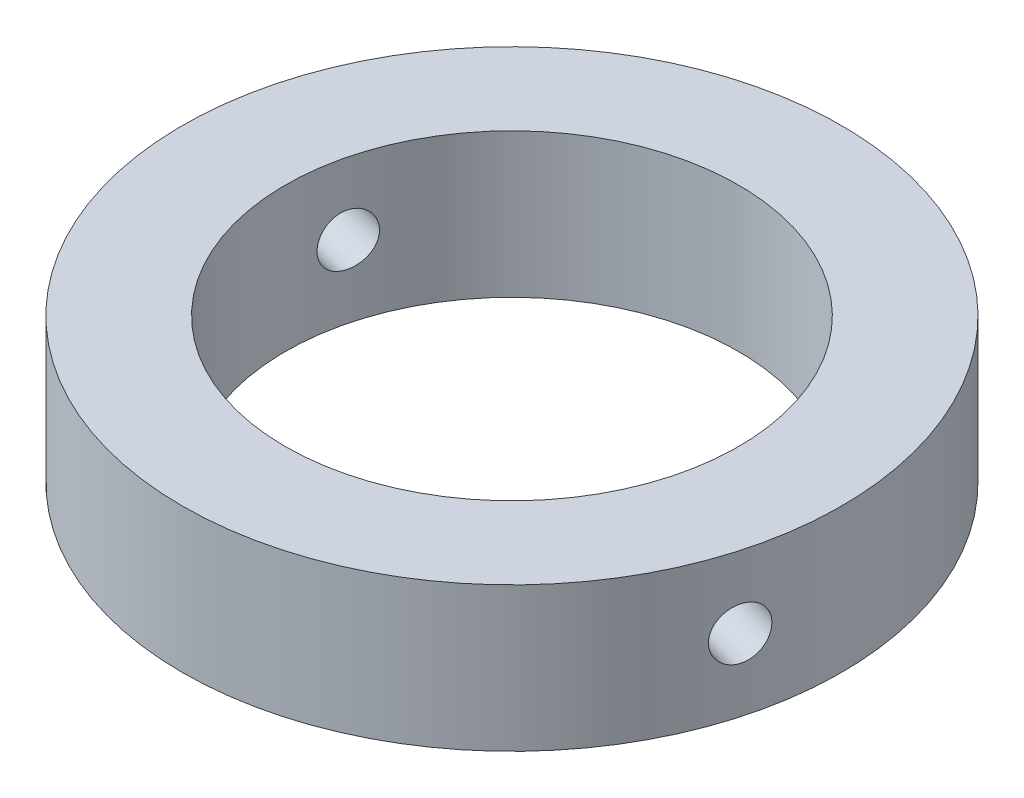
ISO-10303-21;
HEADER;
FILE_DESCRIPTION(('STEP AP214'),'2;1');
FILE_NAME('part.step','',(''),(''),'','','');
FILE_SCHEMA(('AUTOMOTIVE_DESIGN { 1 0 10303 214 1 1 1 1 }'));
ENDSEC;
DATA;
#1=APPLICATION_CONTEXT('core data for automotive mechanical design processes');
#2=APPLICATION_PROTOCOL_DEFINITION('international standard','automotive_design',2000,#1);
#3=PRODUCT_CONTEXT('',#1,'mechanical');
#4=PRODUCT('Part','Part','',(#3));
#5=PRODUCT_RELATED_PRODUCT_CATEGORY('part','',(#4));
#6=PRODUCT_DEFINITION_FORMATION('','',#4);
#7=PRODUCT_DEFINITION_CONTEXT('part definition',#1,'design');
#8=PRODUCT_DEFINITION('design','',#6,#7);
#9=PRODUCT_DEFINITION_SHAPE('','',#8);
#10=(LENGTH_UNIT() NAMED_UNIT(*) SI_UNIT(.MILLI.,.METRE.));
#11=(NAMED_UNIT(*) PLANE_ANGLE_UNIT() SI_UNIT($,.RADIAN.));
#12=(NAMED_UNIT(*) SI_UNIT($,.STERADIAN.) SOLID_ANGLE_UNIT());
#13=UNCERTAINTY_MEASURE_WITH_UNIT(LENGTH_MEASURE(1.E-05),#10,'distance_accuracy_value','');
#14=(GEOMETRIC_REPRESENTATION_CONTEXT(3) GLOBAL_UNCERTAINTY_ASSIGNED_CONTEXT((#13)) GLOBAL_UNIT_ASSIGNED_CONTEXT((#10,
#11,#12)) REPRESENTATION_CONTEXT('',''));
#15=CARTESIAN_POINT('',(0.,0.,0.));
#16=DIRECTION('',(0.,0.,1.));
#17=DIRECTION('',(1.,0.,0.));
#18=AXIS2_PLACEMENT_3D('',#15,#16,#17);
#19=CARTESIAN_POINT('',(0.,7.,0.));
#20=DIRECTION('',(0.,1.,0.));
#21=DIRECTION('',(0.,0.,1.));
#22=AXIS2_PLACEMENT_3D('',#19,#20,#21);
#23=PLANE('',#22);
#24=CARTESIAN_POINT('',(0.,7.,0.));
#25=DIRECTION('',(0.,1.,0.));
#26=DIRECTION('',(0.,0.,1.));
#27=AXIS2_PLACEMENT_3D('',#24,#25,#26);
#28=CIRCLE('',#27,16.);
#29=CARTESIAN_POINT('',(0.,7.,16.));
#30=VERTEX_POINT('',#29);
#31=EDGE_CURVE('E64',#30,#30,#28,.T.);
#32=ORIENTED_EDGE('',*,*,#31,.T.);
#33=EDGE_LOOP('',(#32));
#34=FACE_BOUND('',#33,.T.);
#35=CARTESIAN_POINT('',(0.,7.,0.));
#36=DIRECTION('',(0.,1.,0.));
#37=DIRECTION('',(0.,0.,1.));
#38=AXIS2_PLACEMENT_3D('',#35,#36,#37);
#39=CIRCLE('',#38,11.);
#40=CARTESIAN_POINT('',(0.,7.,11.));
#41=VERTEX_POINT('',#40);
#42=EDGE_CURVE('E128',#41,#41,#39,.T.);
#43=ORIENTED_EDGE('',*,*,#42,.F.);
#44=EDGE_LOOP('',(#43));
#45=FACE_BOUND('',#44,.T.);
#46=ADVANCED_FACE('F51',(#34,#45),#23,.T.);
#47=CARTESIAN_POINT('',(0.,0.,0.));
#48=DIRECTION('',(0.,1.,0.));
#49=DIRECTION('',(0.,0.,1.));
#50=AXIS2_PLACEMENT_3D('',#47,#48,#49);
#51=PLANE('',#50);
#52=CARTESIAN_POINT('',(0.,0.,0.));
#53=DIRECTION('',(0.,1.,0.));
#54=DIRECTION('',(0.,0.,1.));
#55=AXIS2_PLACEMENT_3D('',#52,#53,#54);
#56=CIRCLE('',#55,16.);
#57=CARTESIAN_POINT('',(0.,0.,16.));
#58=VERTEX_POINT('',#57);
#59=EDGE_CURVE('E137',#58,#58,#56,.T.);
#60=ORIENTED_EDGE('',*,*,#59,.F.);
#61=EDGE_LOOP('',(#60));
#62=FACE_BOUND('',#61,.T.);
#63=CARTESIAN_POINT('',(0.,0.,0.));
#64=DIRECTION('',(0.,1.,0.));
#65=DIRECTION('',(0.,0.,1.));
#66=AXIS2_PLACEMENT_3D('',#63,#64,#65);
#67=CIRCLE('',#66,11.);
#68=CARTESIAN_POINT('',(0.,0.,11.));
#69=VERTEX_POINT('',#68);
#70=EDGE_CURVE('E131',#69,#69,#67,.T.);
#71=ORIENTED_EDGE('',*,*,#70,.T.);
#72=EDGE_LOOP('',(#71));
#73=FACE_BOUND('',#72,.T.);
#74=ADVANCED_FACE('F107',(#62,#73),#51,.F.);
#75=CARTESIAN_POINT('',(0.,7.,0.));
#76=DIRECTION('',(0.,-1.,0.));
#77=DIRECTION('',(0.,0.,-1.));
#78=AXIS2_PLACEMENT_3D('',#75,#76,#77);
#79=CYLINDRICAL_SURFACE('',#78,16.);
#80=CARTESIAN_POINT('',(15.7005646405908,3.49811291641236,3.08095276929565));
#81=CARTESIAN_POINT('',(15.7005644420691,3.42801491445671,3.08095589968122));
#82=CARTESIAN_POINT('',(15.6994251998469,3.35786881383582,3.08677707140095));
#83=CARTESIAN_POINT('',(15.6948601261584,3.21951637072107,3.1099034032266));
#84=CARTESIAN_POINT('',(15.6914316842296,3.15131233552285,3.12722167378658));
#85=CARTESIAN_POINT('',(15.6822773810597,3.01886792383957,3.17280844439401));
#86=CARTESIAN_POINT('',(15.6765527973742,2.9546253661132,3.20107085490383));
#87=CARTESIAN_POINT('',(15.662802395416,2.8318954795411,3.26768606611278));
#88=CARTESIAN_POINT('',(15.654777078742,2.77340689996019,3.306036667266));
#89=CARTESIAN_POINT('',(15.6364246705791,2.66369661723308,3.3917758911864));
#90=CARTESIAN_POINT('',(15.6260929779383,2.61248977997289,3.43918255286731));
#91=CARTESIAN_POINT('',(15.6032019991841,2.51892416134812,3.54158640447706));
#92=CARTESIAN_POINT('',(15.5906426170271,2.47656576164207,3.59658392165148));
#93=CARTESIAN_POINT('',(15.5634156314361,2.4018507551443,3.71263318028883));
#94=CARTESIAN_POINT('',(15.548745376405,2.36950689174767,3.77369250599604));
#95=CARTESIAN_POINT('',(15.5175394202269,2.31582060465392,3.9000255586503));
#96=CARTESIAN_POINT('',(15.5010037482194,2.29447800913705,3.96529921975921));
#97=CARTESIAN_POINT('',(15.4664425950264,2.26344256102981,4.09802931182976));
#98=CARTESIAN_POINT('',(15.448420251224,2.25372581385766,4.16548097211445));
#99=CARTESIAN_POINT('',(15.4113083093587,2.24614403909359,4.30075509636418));
#100=CARTESIAN_POINT('',(15.3922187289877,2.24827881509283,4.36857755416558));
#101=CARTESIAN_POINT('',(15.3535727734916,2.26431990296018,4.5025162285706));
#102=CARTESIAN_POINT('',(15.3340175078403,2.2782005183206,4.56863584538343));
#103=CARTESIAN_POINT('',(15.2950405576221,2.31729933096242,4.69747455883542));
#104=CARTESIAN_POINT('',(15.2756188741963,2.34251762497856,4.76019362645548));
#105=CARTESIAN_POINT('',(15.2375857832645,2.4036047068125,4.88057094626758));
#106=CARTESIAN_POINT('',(15.2189752793892,2.43948504083461,4.93822362377868));
#107=CARTESIAN_POINT('',(15.1833067205505,2.52086930547655,5.0468276629502));
#108=CARTESIAN_POINT('',(15.1662486932097,2.56637340728071,5.0977789053816));
#109=CARTESIAN_POINT('',(15.1343427421401,2.66585842397162,5.19173802772221));
#110=CARTESIAN_POINT('',(15.1195008446142,2.71986166051195,5.23472432269902));
#111=CARTESIAN_POINT('',(15.0927253242134,2.83473408968917,5.31143089749065));
#112=CARTESIAN_POINT('',(15.0807917033363,2.89560328704228,5.34515117094061));
#113=CARTESIAN_POINT('',(15.0603703851021,3.0224951089598,5.40242287902375));
#114=CARTESIAN_POINT('',(15.0518830420686,3.08851826258843,5.42597326807231));
#115=CARTESIAN_POINT('',(15.0387517332543,3.22383660707186,5.46226344985772));
#116=CARTESIAN_POINT('',(15.0341076965721,3.29313173754015,5.4750034420254));
#117=CARTESIAN_POINT('',(15.0288905307231,3.43283107296942,5.48930855553032));
#118=CARTESIAN_POINT('',(15.0283066819864,3.50323186528608,5.49090310274886));
#119=CARTESIAN_POINT('',(15.0312093048932,3.6433162626235,5.48295212880204));
#120=CARTESIAN_POINT('',(15.0346957432326,3.71299987350771,5.47340669878667));
#121=CARTESIAN_POINT('',(15.0455663874324,3.849582580776,5.44345320495769));
#122=CARTESIAN_POINT('',(15.0529456768054,3.91648507486175,5.42305884256225));
#123=CARTESIAN_POINT('',(15.0712554443455,4.04571157898017,5.371963474165));
#124=CARTESIAN_POINT('',(15.082185972691,4.10803552430325,5.34126232252935));
#125=CARTESIAN_POINT('',(15.1071296450464,4.22647881737394,5.27029847296326));
#126=CARTESIAN_POINT('',(15.1211491842719,4.2825849246483,5.2300159245918));
#127=CARTESIAN_POINT('',(15.151644253957,4.386866198045,5.14100029610007));
#128=CARTESIAN_POINT('',(15.1681198216129,4.43504124402854,5.09226708799315));
#129=CARTESIAN_POINT('',(15.2028767864163,4.52219915444093,4.98754268323245));
#130=CARTESIAN_POINT('',(15.2211620413271,4.56116175447206,4.93153589838993));
#131=CARTESIAN_POINT('',(15.2587827739058,4.62864983266333,4.8138714333799));
#132=CARTESIAN_POINT('',(15.2781182421748,4.65717540421142,4.75221380378093));
#133=CARTESIAN_POINT('',(15.3171014208714,4.70294476248306,4.6250210649721));
#134=CARTESIAN_POINT('',(15.3367487569412,4.72020116139698,4.55949038031221));
#135=CARTESIAN_POINT('',(15.3757100318623,4.74298356449726,4.42632483848362));
#136=CARTESIAN_POINT('',(15.3950239761792,4.74850976116927,4.35869001586105));
#137=CARTESIAN_POINT('',(15.4326812097393,4.7476727631858,4.22341887433808));
#138=CARTESIAN_POINT('',(15.4510269464529,4.74134118507953,4.15578303888512));
#139=CARTESIAN_POINT('',(15.486322206994,4.71703419600539,4.02226240962753));
#140=CARTESIAN_POINT('',(15.5032717287464,4.69905876773254,3.95637761842543));
#141=CARTESIAN_POINT('',(15.5354050268089,4.65198214768293,3.82825758586287));
#142=CARTESIAN_POINT('',(15.550588876009,4.6228814153908,3.7660221939015));
#143=CARTESIAN_POINT('',(15.5789331057839,4.55438401045252,3.64699751383771));
#144=CARTESIAN_POINT('',(15.5920935239773,4.51498752925744,3.59020812449286));
#145=CARTESIAN_POINT('',(15.6162613107074,4.42689848383207,3.48358778434783));
#146=CARTESIAN_POINT('',(15.62726313788,4.37818261207289,3.43377483425048));
#147=CARTESIAN_POINT('',(15.646990447598,4.27287786715512,3.3427333133688));
#148=CARTESIAN_POINT('',(15.655715376676,4.21628708488255,3.30150683027019));
#149=CARTESIAN_POINT('',(15.670868039766,4.09674177940669,3.2288202267953));
#150=CARTESIAN_POINT('',(15.6772918541651,4.03377663012673,3.19737678225528));
#151=CARTESIAN_POINT('',(15.6878169656134,3.90339096749187,3.14533153112997));
#152=CARTESIAN_POINT('',(15.6919209471144,3.83597570504252,3.12471719533545));
#153=CARTESIAN_POINT('',(15.6967718649969,3.72315092980942,3.10023259771874));
#154=CARTESIAN_POINT('',(15.6981940664078,3.67846812269262,3.09301269821328));
#155=CARTESIAN_POINT('',(15.700090517168,3.58856785894513,3.0833717794504));
#156=CARTESIAN_POINT('',(15.700564768706,3.54335040354914,3.08095074911286));
#157=CARTESIAN_POINT('',(15.7005646405908,3.49811291641236,3.08095276929565));
#158=B_SPLINE_CURVE_WITH_KNOTS('',3,(#80,#81,#82,#83,#84,#85,#86,#87,#88,#89,#90,#91,#92,#93,
#94,#95,#96,#97,#98,#99,#100,#101,#102,#103,#104,#105,#106,#107,#108,#109,#110,#111,#112,#113,
#114,#115,#116,#117,#118,#119,#120,#121,#122,#123,#124,#125,#126,#127,#128,#129,#130,#131,#132,
#133,#134,#135,#136,#137,#138,#139,#140,#141,#142,#143,#144,#145,#146,#147,#148,#149,#150,#151,
#152,#153,#154,#155,#156,#157),.UNSPECIFIED.,.T.,.F.,(4,2,2,2,2,2,2,2,2,2,2,2,2,2,2,2,2,2,2,2,2,
2,2,2,2,2,2,2,2,2,2,2,2,2,2,2,2,2,4),(0.,0.210128842577296,0.42049771331393,0.630749698424032,
0.840955879866511,1.05158522479289,1.26222365289342,1.47312902501727,1.68403110308382,
1.89449896582812,2.1049633406133,2.31496846690295,2.52497538502095,2.73521055914812,
2.94544947318182,3.15625005595317,3.36705078352388,3.57787317875043,3.78869168462875,
3.99895338263198,4.2092133602352,4.41920842291182,4.62920645292116,4.8396433991816,
5.05008353282309,5.26098234750334,5.47187927506665,5.68253976544148,5.89319679897613,
6.10329295426036,6.31338942178842,6.52347721308879,6.73356109805146,6.94417743316642,
7.15484491722764,7.36586955512332,7.57664949811826,7.71225568510991,7.84786155900015),.UNSPECIFIED.);
#159=CARTESIAN_POINT('',(15.7005646405908,3.49811291641236,3.08095276929565));
#160=VERTEX_POINT('',#159);
#161=EDGE_CURVE('E11',#160,#160,#158,.T.);
#162=ORIENTED_EDGE('',*,*,#161,.T.);
#163=EDGE_LOOP('',(#162));
#164=FACE_BOUND('',#163,.T.);
#165=CARTESIAN_POINT('',(-15.7766439830382,3.52658800287419,-2.66411423037106));
#166=CARTESIAN_POINT('',(-15.7766438674801,3.45649000091854,-2.66411736491585));
#167=CARTESIAN_POINT('',(-15.7756591720488,3.38634390029765,-2.66996666298816));
#168=CARTESIAN_POINT('',(-15.7717080950513,3.2479914571829,-2.69320577037316));
#169=CARTESIAN_POINT('',(-15.7687394511089,3.17978742198468,-2.71060875466871));
#170=CARTESIAN_POINT('',(-15.7607955166388,3.0473430103014,-2.75642194955923));
#171=CARTESIAN_POINT('',(-15.755821341965,2.98310045257502,-2.78482603892171));
#172=CARTESIAN_POINT('',(-15.7438397631564,2.86037056600292,-2.85178200719697));
#173=CARTESIAN_POINT('',(-15.7368328021995,2.80188198642202,-2.8903316740526));
#174=CARTESIAN_POINT('',(-15.7207572435844,2.6921717036949,-2.97652681207712));
#175=CARTESIAN_POINT('',(-15.7116845240667,2.64096486643472,-3.02419043767467));
#176=CARTESIAN_POINT('',(-15.6915132733716,2.54739924780994,-3.12716454305188));
#177=CARTESIAN_POINT('',(-15.6804146548501,2.5050408481039,-3.18247535250563));
#178=CARTESIAN_POINT('',(-15.6562702544503,2.43032584160612,-3.29920489933927));
#179=CARTESIAN_POINT('',(-15.6432220227391,2.3979819782095,-3.36063128851939));
#180=CARTESIAN_POINT('',(-15.6153723666303,2.34429569111575,-3.48774638812817));
#181=CARTESIAN_POINT('',(-15.6005709696184,2.32295309559888,-3.55343503197016));
#182=CARTESIAN_POINT('',(-15.5695366895922,2.29191764749164,-3.68703377490711));
#183=CARTESIAN_POINT('',(-15.553306816531,2.28220090031948,-3.75493902191874));
#184=CARTESIAN_POINT('',(-15.519790009452,2.27461912555542,-3.89114845097481));
#185=CARTESIAN_POINT('',(-15.5025030929569,2.27675390155466,-3.9594526263893));
#186=CARTESIAN_POINT('',(-15.4674174468542,2.29279498942201,-4.09436769528503));
#187=CARTESIAN_POINT('',(-15.4496199163706,2.30667560478243,-4.16098195840375));
#188=CARTESIAN_POINT('',(-15.4140683423127,2.34577441742425,-4.29080761963561));
#189=CARTESIAN_POINT('',(-15.3963142991108,2.37099271144039,-4.35401898870959));
#190=CARTESIAN_POINT('',(-15.3614821917773,2.43207979327433,-4.47536122962212));
#191=CARTESIAN_POINT('',(-15.3444048833393,2.46796012729644,-4.53348650480603));
#192=CARTESIAN_POINT('',(-15.3116247170659,2.54934439193838,-4.64299697970722));
#193=CARTESIAN_POINT('',(-15.2959218836861,2.59484849374254,-4.69438205950585));
#194=CARTESIAN_POINT('',(-15.2665152016454,2.69433351043345,-4.78915311751423));
#195=CARTESIAN_POINT('',(-15.2528168054951,2.74833674697378,-4.83251735878414));
#196=CARTESIAN_POINT('',(-15.2280818996779,2.863209176151,-4.90990606301935));
#197=CARTESIAN_POINT('',(-15.2170453918393,2.92407837350411,-4.94393051956913));
#198=CARTESIAN_POINT('',(-15.1981478157935,3.05097019542163,-5.00172291011302));
#199=CARTESIAN_POINT('',(-15.1902870740981,3.11699334905026,-5.02548978950651));
#200=CARTESIAN_POINT('',(-15.1781213506643,3.25231169353369,-5.06211496853032));
#201=CARTESIAN_POINT('',(-15.1738163033303,3.32160682400198,-5.07497346939903));
#202=CARTESIAN_POINT('',(-15.1689797729382,3.46130615943125,-5.08941171948866));
#203=CARTESIAN_POINT('',(-15.1684383532799,3.53170695174791,-5.09102116813125));
#204=CARTESIAN_POINT('',(-15.1711294128945,3.67179134908533,-5.08299611955864));
#205=CARTESIAN_POINT('',(-15.1743618612888,3.74147495996953,-5.07336171434338));
#206=CARTESIAN_POINT('',(-15.1844355112528,3.87805766723783,-5.04313086463185));
#207=CARTESIAN_POINT('',(-15.1912721608794,3.94496016132358,-5.02254824693993));
#208=CARTESIAN_POINT('',(-15.2082224789905,4.07418666544199,-4.97098594506198));
#209=CARTESIAN_POINT('',(-15.2183361937796,4.13651061076508,-4.94000611396445));
#210=CARTESIAN_POINT('',(-15.2413919639185,4.25495390383576,-4.86840662933561));
#211=CARTESIAN_POINT('',(-15.2543398865926,4.31106001111013,-4.82776696297599));
#212=CARTESIAN_POINT('',(-15.2824670879829,4.41534128450682,-4.73797502607281));
#213=CARTESIAN_POINT('',(-15.2976464004933,4.46351633049036,-4.6888226266025));
#214=CARTESIAN_POINT('',(-15.3296180268956,4.55067424090275,-4.58321456507302));
#215=CARTESIAN_POINT('',(-15.3464137844157,4.58963684093389,-4.52674321813605));
#216=CARTESIAN_POINT('',(-15.3809055156354,4.65712491912515,-4.40812380015012));
#217=CARTESIAN_POINT('',(-15.3986014812786,4.68565049067325,-4.34597577990086));
#218=CARTESIAN_POINT('',(-15.4342028677933,4.73141984894488,-4.21779535118723));
#219=CARTESIAN_POINT('',(-15.4521080316025,4.7486762478588,-4.15176737563443));
#220=CARTESIAN_POINT('',(-15.4875293594623,4.77145865095908,-4.01761681839881));
#221=CARTESIAN_POINT('',(-15.5050455298914,4.77698484763109,-3.94949427110527));
#222=CARTESIAN_POINT('',(-15.5391075164323,4.77614784964762,-3.8132733841561));
#223=CARTESIAN_POINT('',(-15.5556557919581,4.76981627154135,-3.74517546296826));
#224=CARTESIAN_POINT('',(-15.587402988117,4.74550928246721,-3.61076702056208));
#225=CARTESIAN_POINT('',(-15.6026019067446,4.72753385419436,-3.54445650200032));
#226=CARTESIAN_POINT('',(-15.6313312595014,4.68045723414475,-3.41553049268341));
#227=CARTESIAN_POINT('',(-15.6448617625069,4.65135650185263,-3.35291484945));
#228=CARTESIAN_POINT('',(-15.6700442247853,4.58285909691434,-3.23318133943957));
#229=CARTESIAN_POINT('',(-15.6816962189827,4.54346261571926,-3.17606337045947));
#230=CARTESIAN_POINT('',(-15.7030321753687,4.45537357029389,-3.06884044467787));
#231=CARTESIAN_POINT('',(-15.7127110748032,4.40665769853471,-3.01875362900477));
#232=CARTESIAN_POINT('',(-15.7300206455855,4.30135295361694,-2.92722164534607));
#233=CARTESIAN_POINT('',(-15.7376508189427,4.24476217134437,-2.8857785789702));
#234=CARTESIAN_POINT('',(-15.750873393905,4.12521686586851,-2.81271621495971));
#235=CARTESIAN_POINT('',(-15.7564623188555,4.06225171658855,-2.78111369110682));
#236=CARTESIAN_POINT('',(-15.7656055573812,3.93186605395369,-2.7288079808549));
#237=CARTESIAN_POINT('',(-15.7691622226877,3.86445079150434,-2.70809219855474));
#238=CARTESIAN_POINT('',(-15.7733630761421,3.75162601627125,-2.68348773239492));
#239=CARTESIAN_POINT('',(-15.7745935925846,3.70694320915445,-2.67623270413813));
#240=CARTESIAN_POINT('',(-15.7762340823728,3.61704294540696,-2.66654494725983));
#241=CARTESIAN_POINT('',(-15.7766440576131,3.57182549001096,-2.66411220750414));
#242=CARTESIAN_POINT('',(-15.7766439830382,3.52658800287419,-2.66411423037106));
#243=B_SPLINE_CURVE_WITH_KNOTS('',3,(#165,#166,#167,#168,#169,#170,#171,#172,#173,#174,#175,
#176,#177,#178,#179,#180,#181,#182,#183,#184,#185,#186,#187,#188,#189,#190,#191,#192,#193,#194,
#195,#196,#197,#198,#199,#200,#201,#202,#203,#204,#205,#206,#207,#208,#209,#210,#211,#212,#213,
#214,#215,#216,#217,#218,#219,#220,#221,#222,#223,#224,#225,#226,#227,#228,#229,#230,#231,#232,
#233,#234,#235,#236,#237,#238,#239,#240,#241,#242),.UNSPECIFIED.,.T.,.F.,(4,2,2,2,2,2,2,2,2,2,2,
2,2,2,2,2,2,2,2,2,2,2,2,2,2,2,2,2,2,2,2,2,2,2,2,2,2,2,4),(0.,0.210128842577296,0.42049771331393,
0.630749698424031,0.84095587986651,1.05158522479289,1.26222365289342,1.47312902501727,
1.68403110308381,1.89449896582811,2.10496334061329,2.31496846690294,2.52497538502094,
2.73521055914811,2.94544947318181,3.15625005595317,3.36705078352387,3.57787317875042,
3.78869168462874,3.99895338263197,4.20921336023519,4.41920842291181,4.62920645292115,
4.83964339918159,5.05008353282308,5.26098234750332,5.47187927506663,5.68253976544147,
5.89319679897611,6.10329295426035,6.31338942178841,6.52347721308877,6.73356109805144,
6.9441774331664,7.15484491722763,7.36586955512331,7.57664949811824,7.71225568510989,
7.84786155900013),.UNSPECIFIED.);
#244=CARTESIAN_POINT('',(-15.7766439830382,3.52658800287419,-2.66411423037106));
#245=VERTEX_POINT('',#244);
#246=EDGE_CURVE('E81',#245,#245,#243,.T.);
#247=ORIENTED_EDGE('',*,*,#246,.T.);
#248=EDGE_LOOP('',(#247));
#249=FACE_BOUND('',#248,.T.);
#250=ORIENTED_EDGE('',*,*,#31,.F.);
#251=EDGE_LOOP('',(#250));
#252=FACE_BOUND('',#251,.T.);
#253=ORIENTED_EDGE('',*,*,#59,.T.);
#254=EDGE_LOOP('',(#253));
#255=FACE_BOUND('',#254,.T.);
#256=ADVANCED_FACE('F53',(#164,#249,#252,#255),#79,.T.);
#257=CARTESIAN_POINT('',(0.,7.,0.));
#258=DIRECTION('',(0.,-1.,0.));
#259=DIRECTION('',(0.,0.,-1.));
#260=AXIS2_PLACEMENT_3D('',#257,#258,#259);
#261=CYLINDRICAL_SURFACE('',#260,11.);
#262=CARTESIAN_POINT('',(-10.9048728688358,3.52658800287419,-1.44351921169341));
#263=CARTESIAN_POINT('',(-10.9048730344096,3.45661858713546,-1.4435223492742));
#264=CARTESIAN_POINT('',(-10.9040991080242,3.3866042178351,-1.44940221485725));
#265=CARTESIAN_POINT('',(-10.9009692426436,3.24852044970176,-1.47275354064532));
#266=CARTESIAN_POINT('',(-10.8986116069599,3.18045321853782,-1.49023743244832));
#267=CARTESIAN_POINT('',(-10.8922224972203,3.04828315523348,-1.53623725738499));
#268=CARTESIAN_POINT('',(-10.8881921005984,2.98417780170832,-1.56474608849399));
#269=CARTESIAN_POINT('',(-10.8783277795428,2.86169538550037,-1.6319103381608));
#270=CARTESIAN_POINT('',(-10.872494187359,2.80331727014766,-1.67056388729503));
#271=CARTESIAN_POINT('',(-10.858855363442,2.69366208223747,-1.75703683149344));
#272=CARTESIAN_POINT('',(-10.8510420555933,2.64241546186687,-1.80489357280344));
#273=CARTESIAN_POINT('',(-10.8333433619051,2.54874063812322,-1.90824917543159));
#274=CARTESIAN_POINT('',(-10.8234578770815,2.5063128562033,-1.96374840177421));
#275=CARTESIAN_POINT('',(-10.8015427968743,2.43137252943777,-2.08092041630146));
#276=CARTESIAN_POINT('',(-10.7895074388629,2.39888728630102,-2.14260959659739));
#277=CARTESIAN_POINT('',(-10.7633788573486,2.34492893459038,-2.27022308818498));
#278=CARTESIAN_POINT('',(-10.7492856975726,2.32345548509168,-2.33614726829007));
#279=CARTESIAN_POINT('',(-10.7193161938218,2.29222054878172,-2.4700084655657));
#280=CARTESIAN_POINT('',(-10.7034478476246,2.28240867701355,-2.53793551438381));
#281=CARTESIAN_POINT('',(-10.6702418703352,2.27461938866694,-2.67410706415277));
#282=CARTESIAN_POINT('',(-10.6529042875822,2.27664158288543,-2.74235155458973));
#283=CARTESIAN_POINT('',(-10.6173583989137,2.29242239545181,-2.87689442091315));
#284=CARTESIAN_POINT('',(-10.5991544785543,2.30612683098066,-2.94320032196127));
#285=CARTESIAN_POINT('',(-10.5624411325248,2.34479854772885,-3.07235212098508));
#286=CARTESIAN_POINT('',(-10.5439317019198,2.36976601104451,-3.13519796300143));
#287=CARTESIAN_POINT('',(-10.5072999133736,2.43031352807852,-3.25586200538619));
#288=CARTESIAN_POINT('',(-10.4891785178231,2.46591728401077,-3.31366860054612));
#289=CARTESIAN_POINT('',(-10.4541540445467,2.54670950142704,-3.42256337173422));
#290=CARTESIAN_POINT('',(-10.4372510130422,2.59189832628527,-3.47365129293548));
#291=CARTESIAN_POINT('',(-10.4053631461035,2.69088201726706,-3.56804134130156));
#292=CARTESIAN_POINT('',(-10.3903896877175,2.74472406365249,-3.61129784925092));
#293=CARTESIAN_POINT('',(-10.3632244204087,2.85932302442144,-3.68853101554693));
#294=CARTESIAN_POINT('',(-10.3510326177049,2.92007995426393,-3.72250765314686));
#295=CARTESIAN_POINT('',(-10.3300700203046,3.04682312925436,-3.78029140315372));
#296=CARTESIAN_POINT('',(-10.3213002971996,3.11281100465283,-3.80409533029521));
#297=CARTESIAN_POINT('',(-10.307669566051,3.24812304032396,-3.84087702997467));
#298=CARTESIAN_POINT('',(-10.3028084032592,3.31744706839599,-3.85385523112716));
#299=CARTESIAN_POINT('',(-10.2972841545012,3.45704951155335,-3.86859169980293));
#300=CARTESIAN_POINT('',(-10.2965978004164,3.52732044507322,-3.87041215498432));
#301=CARTESIAN_POINT('',(-10.2993997114014,3.6671851170773,-3.86294975966265));
#302=CARTESIAN_POINT('',(-10.3028879032615,3.73677886741579,-3.85366710387657));
#303=CARTESIAN_POINT('',(-10.3138276443691,3.87311855107512,-3.82429096101489));
#304=CARTESIAN_POINT('',(-10.3212682597361,3.93987179470749,-3.80422729647619));
#305=CARTESIAN_POINT('',(-10.3396996920027,4.06886357487045,-3.75384145838521));
#306=CARTESIAN_POINT('',(-10.3506906129369,4.13110197903745,-3.72351898421823));
#307=CARTESIAN_POINT('',(-10.3756987063111,4.24959694070775,-3.6532544139334));
#308=CARTESIAN_POINT('',(-10.389728925667,4.30582609750421,-3.61327075668748));
#309=CARTESIAN_POINT('',(-10.4200761436053,4.41042767506543,-3.5247971178709));
#310=CARTESIAN_POINT('',(-10.4363932154657,4.4587998439596,-3.47630686370881));
#311=CARTESIAN_POINT('',(-10.4706122414936,4.54654406354642,-3.37184053789794));
#312=CARTESIAN_POINT('',(-10.488521259201,4.58587290996911,-3.31583047663723));
#313=CARTESIAN_POINT('',(-10.5250469390189,4.65411593352292,-3.19799724449341));
#314=CARTESIAN_POINT('',(-10.5436635890182,4.6830302888106,-3.13617417307397));
#315=CARTESIAN_POINT('',(-10.5807862123377,4.72955131311807,-3.00854881739467));
#316=CARTESIAN_POINT('',(-10.5992923409405,4.74718349145613,-2.94275588065248));
#317=CARTESIAN_POINT('',(-10.6355472806221,4.77072276968577,-2.80890355354194));
#318=CARTESIAN_POINT('',(-10.6532961196124,4.77663030208206,-2.74084424687076));
#319=CARTESIAN_POINT('',(-10.6873744450441,4.77654548393631,-2.60478761483547));
#320=CARTESIAN_POINT('',(-10.7037113623464,4.77061996664064,-2.53679209922377));
#321=CARTESIAN_POINT('',(-10.7346677533338,4.74717812685107,-2.40242857741892));
#322=CARTESIAN_POINT('',(-10.7492872268727,4.72966180337126,-2.33606057136421));
#323=CARTESIAN_POINT('',(-10.7765504676661,4.68355540430322,-2.20688027645653));
#324=CARTESIAN_POINT('',(-10.7891947001391,4.65496794177911,-2.14406715256956));
#325=CARTESIAN_POINT('',(-10.8124014911517,4.58753771521377,-2.02379104926698));
#326=CARTESIAN_POINT('',(-10.8229640425402,4.54869491594399,-1.96632808823084));
#327=CARTESIAN_POINT('',(-10.842067454657,4.46160751173068,-1.85812094023108));
#328=CARTESIAN_POINT('',(-10.8505970526741,4.41331311168018,-1.80741483940572));
#329=CARTESIAN_POINT('',(-10.8656542608884,4.3087950752785,-1.71457733684079));
#330=CARTESIAN_POINT('',(-10.8721813936861,4.25256955275812,-1.67244798065135));
#331=CARTESIAN_POINT('',(-10.8833844230677,4.1335818283229,-1.59792753866624));
#332=CARTESIAN_POINT('',(-10.8880543053994,4.07079920825092,-1.56556817076108));
#333=CARTESIAN_POINT('',(-10.8956502718218,3.94066311427726,-1.51180325916632));
#334=CARTESIAN_POINT('',(-10.8985782870423,3.87331479482203,-1.49038558864476));
#335=CARTESIAN_POINT('',(-10.9020940600394,3.75909934650181,-1.46439352355178));
#336=CARTESIAN_POINT('',(-10.9031376390538,3.71295761913711,-1.45657738973311));
#337=CARTESIAN_POINT('',(-10.9045269860901,3.62007995097902,-1.44613920067409));
#338=CARTESIAN_POINT('',(-10.9048727581936,3.57334401366295,-1.44351711505218));
#339=CARTESIAN_POINT('',(-10.9048728688358,3.52658800287419,-1.44351921169341));
#340=B_SPLINE_CURVE_WITH_KNOTS('',3,(#262,#263,#264,#265,#266,#267,#268,#269,#270,#271,#272,
#273,#274,#275,#276,#277,#278,#279,#280,#281,#282,#283,#284,#285,#286,#287,#288,#289,#290,#291,
#292,#293,#294,#295,#296,#297,#298,#299,#300,#301,#302,#303,#304,#305,#306,#307,#308,#309,#310,
#311,#312,#313,#314,#315,#316,#317,#318,#319,#320,#321,#322,#323,#324,#325,#326,#327,#328,#329,
#330,#331,#332,#333,#334,#335,#336,#337,#338,#339),.UNSPECIFIED.,.T.,.F.,(4,2,2,2,2,2,2,2,2,2,2,
2,2,2,2,2,2,2,2,2,2,2,2,2,2,2,2,2,2,2,2,2,2,2,2,2,2,2,4),(0.,0.20973747102022,0.419700000972301,
0.629527502350869,0.839316364765072,1.04997522707931,1.26064415448741,1.47188648272737,
1.68312227051642,1.89344203717233,2.10375488679386,2.31309756927457,2.52244363644886,
2.7322597410701,2.94208380133524,3.15309333304238,3.36410333649309,3.5751793627892,
3.78624703172036,3.9961372380184,4.20602376349343,4.4153326652708,4.62464770097442,
4.83487973574453,5.04511850857032,5.25634173818705,5.46756135432009,5.67830169349603,
5.88903425863094,6.09857996924771,6.30812569768829,6.51762199823874,6.72711901844814,
6.93775100821765,7.14843317493095,7.35979213527309,7.57091633262039,7.71107106616894,
7.85122497990815),.UNSPECIFIED.);
#341=CARTESIAN_POINT('',(-10.9048728688358,3.52658800287419,-1.44351921169341));
#342=VERTEX_POINT('',#341);
#343=EDGE_CURVE('E77',#342,#342,#340,.T.);
#344=ORIENTED_EDGE('',*,*,#343,.F.);
#345=EDGE_LOOP('',(#344));
#346=FACE_BOUND('',#345,.T.);
#347=ORIENTED_EDGE('',*,*,#42,.T.);
#348=EDGE_LOOP('',(#347));
#349=FACE_BOUND('',#348,.T.);
#350=ORIENTED_EDGE('',*,*,#70,.F.);
#351=EDGE_LOOP('',(#350));
#352=FACE_BOUND('',#351,.T.);
#353=ADVANCED_FACE('F98',(#346,#349,#352),#261,.F.);
#354=CARTESIAN_POINT('',(-15.5202898714782,3.52658800287419,-3.88852186637698));
#355=DIRECTION('',(-0.970018116967386,0.,-0.243032616648562));
#356=DIRECTION('',(-0.243032616648562,0.,0.970018116967386));
#357=AXIS2_PLACEMENT_3D('',#354,#355,#356);
#358=CYLINDRICAL_SURFACE('',#357,1.25);
#359=ORIENTED_EDGE('',*,*,#343,.T.);
#360=EDGE_LOOP('',(#359));
#361=FACE_BOUND('',#360,.T.);
#362=ORIENTED_EDGE('',*,*,#246,.F.);
#363=EDGE_LOOP('',(#362));
#364=FACE_BOUND('',#363,.T.);
#365=ADVANCED_FACE('F95',(#361,#364),#358,.F.);
#366=CARTESIAN_POINT('',(15.4118775492623,3.49811291641236,4.29814266940313));
#367=DIRECTION('',(0.963242346828895,0.,0.268633916837696));
#368=DIRECTION('',(0.268633916837696,0.,-0.963242346828895));
#369=AXIS2_PLACEMENT_3D('',#366,#367,#368);
#370=CYLINDRICAL_SURFACE('',#369,1.25);
#371=CARTESIAN_POINT('',(12.2823761529332,3.49811291641236,3.42537142900597));
#372=DIRECTION('',(0.963242346828895,0.,0.268633916837696));
#373=DIRECTION('',(0.268633916837696,0.,-0.963242346828895));
#374=AXIS2_PLACEMENT_3D('',#371,#372,#373);
#375=CIRCLE('',#374,1.25);
#376=CARTESIAN_POINT('',(12.6181685489803,3.49811291641236,2.22131849546985));
#377=VERTEX_POINT('',#376);
#378=EDGE_CURVE('E74',#377,#377,#375,.T.);
#379=ORIENTED_EDGE('',*,*,#378,.F.);
#380=EDGE_LOOP('',(#379));
#381=FACE_BOUND('',#380,.T.);
#382=ORIENTED_EDGE('',*,*,#161,.F.);
#383=EDGE_LOOP('',(#382));
#384=FACE_BOUND('',#383,.T.);
#385=ADVANCED_FACE('F70',(#381,#384),#370,.F.);
#386=CARTESIAN_POINT('',(12.2823761529332,3.49811291641236,3.42537142900597));
#387=DIRECTION('',(0.963242346828895,0.,0.268633916837696));
#388=DIRECTION('',(0.268633916837696,0.,-0.963242346828895));
#389=AXIS2_PLACEMENT_3D('',#386,#387,#388);
#390=CONICAL_SURFACE('',#389,1.25,1.02974425867665);
#391=CARTESIAN_POINT('',(11.5589081619467,3.49811291641236,3.22360700205235));
#392=VERTEX_POINT('',#391);
#393=VERTEX_LOOP('',#392);
#394=FACE_BOUND('',#393,.T.);
#395=ORIENTED_EDGE('',*,*,#378,.T.);
#396=EDGE_LOOP('',(#395));
#397=FACE_BOUND('',#396,.T.);
#398=ADVANCED_FACE('F67',(#394,#397),#390,.F.);
#399=CLOSED_SHELL('',(#46,#74,#256,#353,#365,#385,#398));
#400=MANIFOLD_SOLID_BREP('B2',#399);
#401=ADVANCED_BREP_SHAPE_REPRESENTATION('',(#18,#400),#14);
#402=SHAPE_DEFINITION_REPRESENTATION(#9,#401);
ENDSEC;
END-ISO-10303-21;
